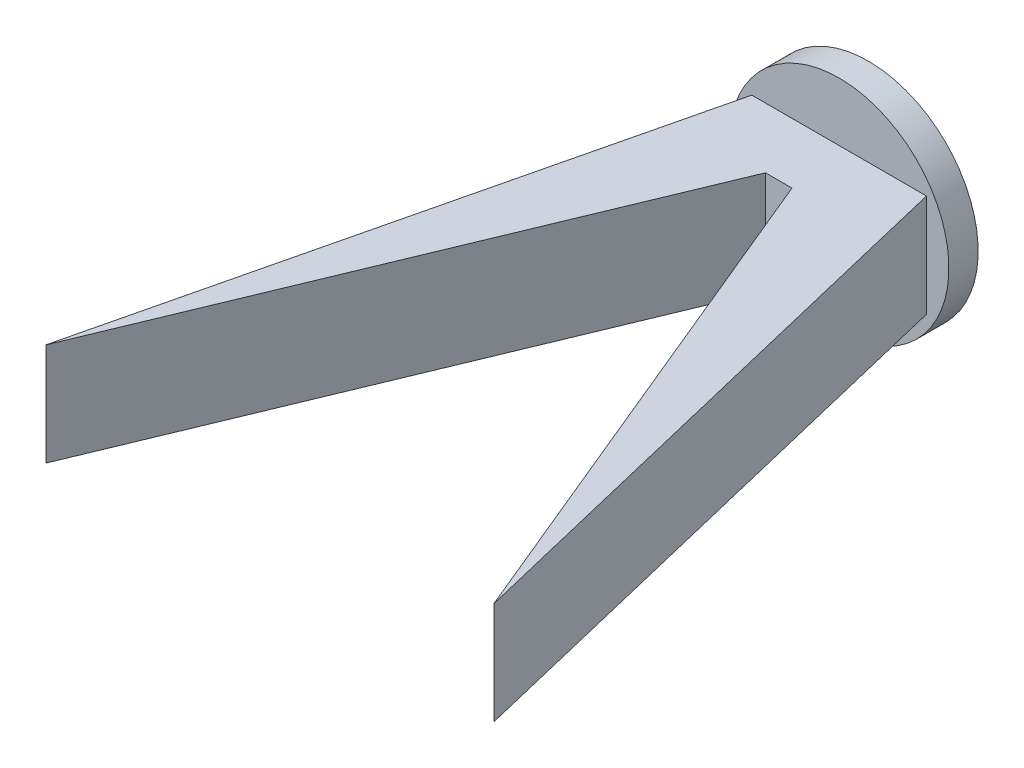
ISO-10303-21;
HEADER;
FILE_DESCRIPTION(('STEP AP214'),'2;1');
FILE_NAME('part.step','',(''),(''),'','','');
FILE_SCHEMA(('AUTOMOTIVE_DESIGN { 1 0 10303 214 1 1 1 1 }'));
ENDSEC;
DATA;
#1=APPLICATION_CONTEXT('core data for automotive mechanical design processes');
#2=APPLICATION_PROTOCOL_DEFINITION('international standard','automotive_design',2000,#1);
#3=PRODUCT_CONTEXT('',#1,'mechanical');
#4=PRODUCT('Part','Part','',(#3));
#5=PRODUCT_RELATED_PRODUCT_CATEGORY('part','',(#4));
#6=PRODUCT_DEFINITION_FORMATION('','',#4);
#7=PRODUCT_DEFINITION_CONTEXT('part definition',#1,'design');
#8=PRODUCT_DEFINITION('design','',#6,#7);
#9=PRODUCT_DEFINITION_SHAPE('','',#8);
#10=(LENGTH_UNIT() NAMED_UNIT(*) SI_UNIT(.MILLI.,.METRE.));
#11=(NAMED_UNIT(*) PLANE_ANGLE_UNIT() SI_UNIT($,.RADIAN.));
#12=(NAMED_UNIT(*) SI_UNIT($,.STERADIAN.) SOLID_ANGLE_UNIT());
#13=UNCERTAINTY_MEASURE_WITH_UNIT(LENGTH_MEASURE(1.E-05),#10,'distance_accuracy_value','');
#14=(GEOMETRIC_REPRESENTATION_CONTEXT(3) GLOBAL_UNCERTAINTY_ASSIGNED_CONTEXT((#13)) GLOBAL_UNIT_ASSIGNED_CONTEXT((#10,
#11,#12)) REPRESENTATION_CONTEXT('',''));
#15=CARTESIAN_POINT('',(0.,0.,0.));
#16=DIRECTION('',(0.,0.,1.));
#17=DIRECTION('',(1.,0.,0.));
#18=AXIS2_PLACEMENT_3D('',#15,#16,#17);
#19=CARTESIAN_POINT('',(0.,7.,2.18838694100417));
#20=DIRECTION('',(0.,0.,-1.));
#21=DIRECTION('',(-1.,0.,0.));
#22=AXIS2_PLACEMENT_3D('',#19,#20,#21);
#23=PLANE('',#22);
#24=DIRECTION('',(1.,0.,0.));
#25=VECTOR('',#24,1.);
#26=CARTESIAN_POINT('',(0.,0.,2.18838694100417));
#27=LINE('',#26,#25);
#28=CARTESIAN_POINT('',(-0.906459550684099,0.,2.18838694100417));
#29=VERTEX_POINT('',#28);
#30=CARTESIAN_POINT('',(0.906459550684099,0.,2.18838694100417));
#31=VERTEX_POINT('',#30);
#32=EDGE_CURVE('E147',#29,#31,#27,.T.);
#33=ORIENTED_EDGE('',*,*,#32,.T.);
#34=DIRECTION('',(0.,-1.,0.));
#35=VECTOR('',#34,1.);
#36=CARTESIAN_POINT('',(0.906459550684099,7.,2.18838694100417));
#37=LINE('',#36,#35);
#38=CARTESIAN_POINT('',(0.906459550684099,7.,2.18838694100417));
#39=VERTEX_POINT('',#38);
#40=EDGE_CURVE('E11',#39,#31,#37,.T.);
#41=ORIENTED_EDGE('',*,*,#40,.F.);
#42=DIRECTION('',(1.,0.,0.));
#43=VECTOR('',#42,1.);
#44=CARTESIAN_POINT('',(0.,7.,2.18838694100417));
#45=LINE('',#44,#43);
#46=CARTESIAN_POINT('',(-0.906459550684099,7.,2.18838694100417));
#47=VERTEX_POINT('',#46);
#48=EDGE_CURVE('E156',#47,#39,#45,.T.);
#49=ORIENTED_EDGE('',*,*,#48,.F.);
#50=DIRECTION('',(0.,-1.,0.));
#51=VECTOR('',#50,1.);
#52=CARTESIAN_POINT('',(-0.906459550684099,7.,2.18838694100417));
#53=LINE('',#52,#51);
#54=EDGE_CURVE('E58',#47,#29,#53,.T.);
#55=ORIENTED_EDGE('',*,*,#54,.T.);
#56=EDGE_LOOP('',(#33,#41,#49,#55));
#57=FACE_BOUND('',#56,.T.);
#58=ADVANCED_FACE('F41',(#57),#23,.F.);
#59=CARTESIAN_POINT('',(0.,7.,0.));
#60=DIRECTION('',(0.923879532511287,0.,-0.38268343236509));
#61=DIRECTION('',(-0.38268343236509,0.,-0.923879532511287));
#62=AXIS2_PLACEMENT_3D('',#59,#60,#61);
#63=PLANE('',#62);
#64=DIRECTION('',(0.38268343236509,0.,0.923879532511287));
#65=VECTOR('',#64,1.);
#66=CARTESIAN_POINT('',(0.,0.,0.));
#67=LINE('',#66,#65);
#68=CARTESIAN_POINT('',(15.3073372946036,0.,36.9551813004515));
#69=VERTEX_POINT('',#68);
#70=EDGE_CURVE('E140',#31,#69,#67,.T.);
#71=ORIENTED_EDGE('',*,*,#70,.T.);
#72=DIRECTION('',(0.,-1.,0.));
#73=VECTOR('',#72,1.);
#74=CARTESIAN_POINT('',(15.3073372946036,7.,36.9551813004515));
#75=LINE('',#74,#73);
#76=CARTESIAN_POINT('',(15.3073372946036,7.,36.9551813004515));
#77=VERTEX_POINT('',#76);
#78=EDGE_CURVE('E50',#77,#69,#75,.T.);
#79=ORIENTED_EDGE('',*,*,#78,.F.);
#80=DIRECTION('',(0.38268343236509,0.,0.923879532511287));
#81=VECTOR('',#80,1.);
#82=CARTESIAN_POINT('',(0.,7.,0.));
#83=LINE('',#82,#81);
#84=EDGE_CURVE('E88',#39,#77,#83,.T.);
#85=ORIENTED_EDGE('',*,*,#84,.F.);
#86=ORIENTED_EDGE('',*,*,#40,.T.);
#87=EDGE_LOOP('',(#71,#79,#85,#86));
#88=FACE_BOUND('',#87,.T.);
#89=ADVANCED_FACE('F178',(#88),#63,.F.);
#90=CARTESIAN_POINT('',(6.08448673274462,7.,-1.46075602443681));
#91=DIRECTION('',(-0.972369920397675,0.,0.233445363855913));
#92=DIRECTION('',(0.233445363855913,0.,0.972369920397675));
#93=AXIS2_PLACEMENT_3D('',#90,#91,#92);
#94=PLANE('',#93);
#95=DIRECTION('',(-0.233445363855913,0.,-0.972369920397675));
#96=VECTOR('',#95,1.);
#97=CARTESIAN_POINT('',(6.08448673274462,0.,-1.46075602443681));
#98=LINE('',#97,#96);
#99=CARTESIAN_POINT('',(5.96952274036711,0.,-1.93961551545554));
#100=VERTEX_POINT('',#99);
#101=EDGE_CURVE('E137',#69,#100,#98,.T.);
#102=ORIENTED_EDGE('',*,*,#101,.T.);
#103=DIRECTION('',(0.,-1.,0.));
#104=VECTOR('',#103,1.);
#105=CARTESIAN_POINT('',(5.96952274036711,7.,-1.93961551545554));
#106=LINE('',#105,#104);
#107=CARTESIAN_POINT('',(5.96952274036711,7.,-1.93961551545554));
#108=VERTEX_POINT('',#107);
#109=EDGE_CURVE('E124',#108,#100,#106,.T.);
#110=ORIENTED_EDGE('',*,*,#109,.F.);
#111=DIRECTION('',(-0.233445363855913,0.,-0.972369920397675));
#112=VECTOR('',#111,1.);
#113=CARTESIAN_POINT('',(6.08448673274462,7.,-1.46075602443681));
#114=LINE('',#113,#112);
#115=EDGE_CURVE('E105',#77,#108,#114,.T.);
#116=ORIENTED_EDGE('',*,*,#115,.F.);
#117=ORIENTED_EDGE('',*,*,#78,.T.);
#118=EDGE_LOOP('',(#102,#110,#116,#117));
#119=FACE_BOUND('',#118,.T.);
#120=ADVANCED_FACE('F136',(#119),#94,.F.);
#121=CARTESIAN_POINT('',(-6.08448673274464,7.,-1.46075602443681));
#122=DIRECTION('',(-0.972369920397675,0.,-0.233445363855913));
#123=DIRECTION('',(-0.233445363855913,0.,0.972369920397675));
#124=AXIS2_PLACEMENT_3D('',#121,#122,#123);
#125=PLANE('',#124);
#126=DIRECTION('',(0.233445363855913,0.,-0.972369920397675));
#127=VECTOR('',#126,1.);
#128=CARTESIAN_POINT('',(-6.08448673274464,0.,-1.46075602443681));
#129=LINE('',#128,#127);
#130=CARTESIAN_POINT('',(-15.3073372946036,0.,36.9551813004515));
#131=VERTEX_POINT('',#130);
#132=CARTESIAN_POINT('',(-5.96952274036712,0.,-1.93961551545554));
#133=VERTEX_POINT('',#132);
#134=EDGE_CURVE('E145',#131,#133,#129,.T.);
#135=ORIENTED_EDGE('',*,*,#134,.F.);
#136=DIRECTION('',(0.,-1.,0.));
#137=VECTOR('',#136,1.);
#138=CARTESIAN_POINT('',(-15.3073372946036,7.,36.9551813004515));
#139=LINE('',#138,#137);
#140=CARTESIAN_POINT('',(-15.3073372946036,7.,36.9551813004515));
#141=VERTEX_POINT('',#140);
#142=EDGE_CURVE('E76',#141,#131,#139,.T.);
#143=ORIENTED_EDGE('',*,*,#142,.F.);
#144=DIRECTION('',(0.233445363855913,0.,-0.972369920397675));
#145=VECTOR('',#144,1.);
#146=CARTESIAN_POINT('',(-6.08448673274464,7.,-1.46075602443681));
#147=LINE('',#146,#145);
#148=CARTESIAN_POINT('',(-5.96952274036712,7.,-1.93961551545554));
#149=VERTEX_POINT('',#148);
#150=EDGE_CURVE('E103',#141,#149,#147,.T.);
#151=ORIENTED_EDGE('',*,*,#150,.T.);
#152=DIRECTION('',(0.,-1.,0.));
#153=VECTOR('',#152,1.);
#154=CARTESIAN_POINT('',(-5.96952274036712,7.,-1.93961551545554));
#155=LINE('',#154,#153);
#156=EDGE_CURVE('E114',#149,#133,#155,.T.);
#157=ORIENTED_EDGE('',*,*,#156,.T.);
#158=EDGE_LOOP('',(#135,#143,#151,#157));
#159=FACE_BOUND('',#158,.T.);
#160=ADVANCED_FACE('F113',(#159),#125,.T.);
#161=CARTESIAN_POINT('',(0.,7.,0.));
#162=DIRECTION('',(0.923879532511286,0.,0.382683432365091));
#163=DIRECTION('',(0.382683432365091,0.,-0.923879532511286));
#164=AXIS2_PLACEMENT_3D('',#161,#162,#163);
#165=PLANE('',#164);
#166=DIRECTION('',(-0.382683432365091,0.,0.923879532511287));
#167=VECTOR('',#166,1.);
#168=CARTESIAN_POINT('',(0.,0.,0.));
#169=LINE('',#168,#167);
#170=EDGE_CURVE('E153',#29,#131,#169,.T.);
#171=ORIENTED_EDGE('',*,*,#170,.F.);
#172=ORIENTED_EDGE('',*,*,#54,.F.);
#173=DIRECTION('',(-0.382683432365091,0.,0.923879532511287));
#174=VECTOR('',#173,1.);
#175=CARTESIAN_POINT('',(0.,7.,0.));
#176=LINE('',#175,#174);
#177=EDGE_CURVE('E117',#47,#141,#176,.T.);
#178=ORIENTED_EDGE('',*,*,#177,.T.);
#179=ORIENTED_EDGE('',*,*,#142,.T.);
#180=EDGE_LOOP('',(#171,#172,#178,#179));
#181=FACE_BOUND('',#180,.T.);
#182=ADVANCED_FACE('F188',(#181),#165,.T.);
#183=CARTESIAN_POINT('',(0.,7.,0.));
#184=DIRECTION('',(0.,1.,0.));
#185=DIRECTION('',(0.,0.,1.));
#186=AXIS2_PLACEMENT_3D('',#183,#184,#185);
#187=PLANE('',#186);
#188=ORIENTED_EDGE('',*,*,#48,.T.);
#189=ORIENTED_EDGE('',*,*,#84,.T.);
#190=ORIENTED_EDGE('',*,*,#115,.T.);
#191=DIRECTION('',(-1.,0.,0.));
#192=VECTOR('',#191,1.);
#193=CARTESIAN_POINT('',(0.,7.,-1.93961551545554));
#194=LINE('',#193,#192);
#195=EDGE_CURVE('E99',#108,#149,#194,.T.);
#196=ORIENTED_EDGE('',*,*,#195,.T.);
#197=ORIENTED_EDGE('',*,*,#150,.F.);
#198=ORIENTED_EDGE('',*,*,#177,.F.);
#199=EDGE_LOOP('',(#188,#189,#190,#196,#197,#198));
#200=FACE_BOUND('',#199,.T.);
#201=ADVANCED_FACE('F101',(#200),#187,.T.);
#202=CARTESIAN_POINT('',(0.,0.,0.));
#203=DIRECTION('',(0.,1.,0.));
#204=DIRECTION('',(0.,0.,1.));
#205=AXIS2_PLACEMENT_3D('',#202,#203,#204);
#206=PLANE('',#205);
#207=ORIENTED_EDGE('',*,*,#32,.F.);
#208=ORIENTED_EDGE('',*,*,#170,.T.);
#209=ORIENTED_EDGE('',*,*,#134,.T.);
#210=DIRECTION('',(-1.,0.,0.));
#211=VECTOR('',#210,1.);
#212=CARTESIAN_POINT('',(0.,0.,-1.93961551545554));
#213=LINE('',#212,#211);
#214=EDGE_CURVE('E122',#100,#133,#213,.T.);
#215=ORIENTED_EDGE('',*,*,#214,.F.);
#216=ORIENTED_EDGE('',*,*,#101,.F.);
#217=ORIENTED_EDGE('',*,*,#70,.F.);
#218=EDGE_LOOP('',(#207,#208,#209,#215,#216,#217));
#219=FACE_BOUND('',#218,.T.);
#220=ADVANCED_FACE('F139',(#219),#206,.F.);
#221=CARTESIAN_POINT('',(0.,3.5,-1.93961551545554));
#222=DIRECTION('',(0.,0.,-1.));
#223=DIRECTION('',(-1.,0.,0.));
#224=AXIS2_PLACEMENT_3D('',#221,#222,#223);
#225=PLANE('',#224);
#226=CARTESIAN_POINT('',(0.,3.5,-1.93961551545554));
#227=DIRECTION('',(0.,0.,-1.));
#228=DIRECTION('',(-1.,0.,0.));
#229=AXIS2_PLACEMENT_3D('',#226,#227,#228);
#230=CIRCLE('',#229,7.5);
#231=CARTESIAN_POINT('',(-7.50000000000001,3.5,-1.93961551545554));
#232=VERTEX_POINT('',#231);
#233=EDGE_CURVE('E165',#232,#232,#230,.T.);
#234=ORIENTED_EDGE('',*,*,#233,.F.);
#235=EDGE_LOOP('',(#234));
#236=FACE_BOUND('',#235,.T.);
#237=ORIENTED_EDGE('',*,*,#109,.T.);
#238=ORIENTED_EDGE('',*,*,#214,.T.);
#239=ORIENTED_EDGE('',*,*,#156,.F.);
#240=ORIENTED_EDGE('',*,*,#195,.F.);
#241=EDGE_LOOP('',(#237,#238,#239,#240));
#242=FACE_BOUND('',#241,.T.);
#243=ADVANCED_FACE('F120',(#236,#242),#225,.F.);
#244=CARTESIAN_POINT('',(0.,3.5,-3.93961551545554));
#245=DIRECTION('',(0.,0.,1.));
#246=DIRECTION('',(1.,0.,0.));
#247=AXIS2_PLACEMENT_3D('',#244,#245,#246);
#248=CYLINDRICAL_SURFACE('',#247,7.5);
#249=CARTESIAN_POINT('',(0.,3.5,-3.93961551545554));
#250=DIRECTION('',(0.,0.,-1.));
#251=DIRECTION('',(-1.,0.,0.));
#252=AXIS2_PLACEMENT_3D('',#249,#250,#251);
#253=CIRCLE('',#252,7.5);
#254=CARTESIAN_POINT('',(-7.50000000000001,3.5,-3.93961551545554));
#255=VERTEX_POINT('',#254);
#256=EDGE_CURVE('E161',#255,#255,#253,.T.);
#257=ORIENTED_EDGE('',*,*,#256,.F.);
#258=EDGE_LOOP('',(#257));
#259=FACE_BOUND('',#258,.T.);
#260=ORIENTED_EDGE('',*,*,#233,.T.);
#261=EDGE_LOOP('',(#260));
#262=FACE_BOUND('',#261,.T.);
#263=ADVANCED_FACE('F195',(#259,#262),#248,.T.);
#264=CARTESIAN_POINT('',(0.,3.5,-3.93961551545554));
#265=DIRECTION('',(0.,0.,-1.));
#266=DIRECTION('',(-1.,0.,0.));
#267=AXIS2_PLACEMENT_3D('',#264,#265,#266);
#268=PLANE('',#267);
#269=ORIENTED_EDGE('',*,*,#256,.T.);
#270=EDGE_LOOP('',(#269));
#271=FACE_BOUND('',#270,.T.);
#272=ADVANCED_FACE('F198',(#271),#268,.T.);
#273=CLOSED_SHELL('',(#58,#89,#120,#160,#182,#201,#220,#243,#263,#272));
#274=MANIFOLD_SOLID_BREP('B2',#273);
#275=ADVANCED_BREP_SHAPE_REPRESENTATION('',(#18,#274),#14);
#276=SHAPE_DEFINITION_REPRESENTATION(#9,#275);
ENDSEC;
END-ISO-10303-21;
